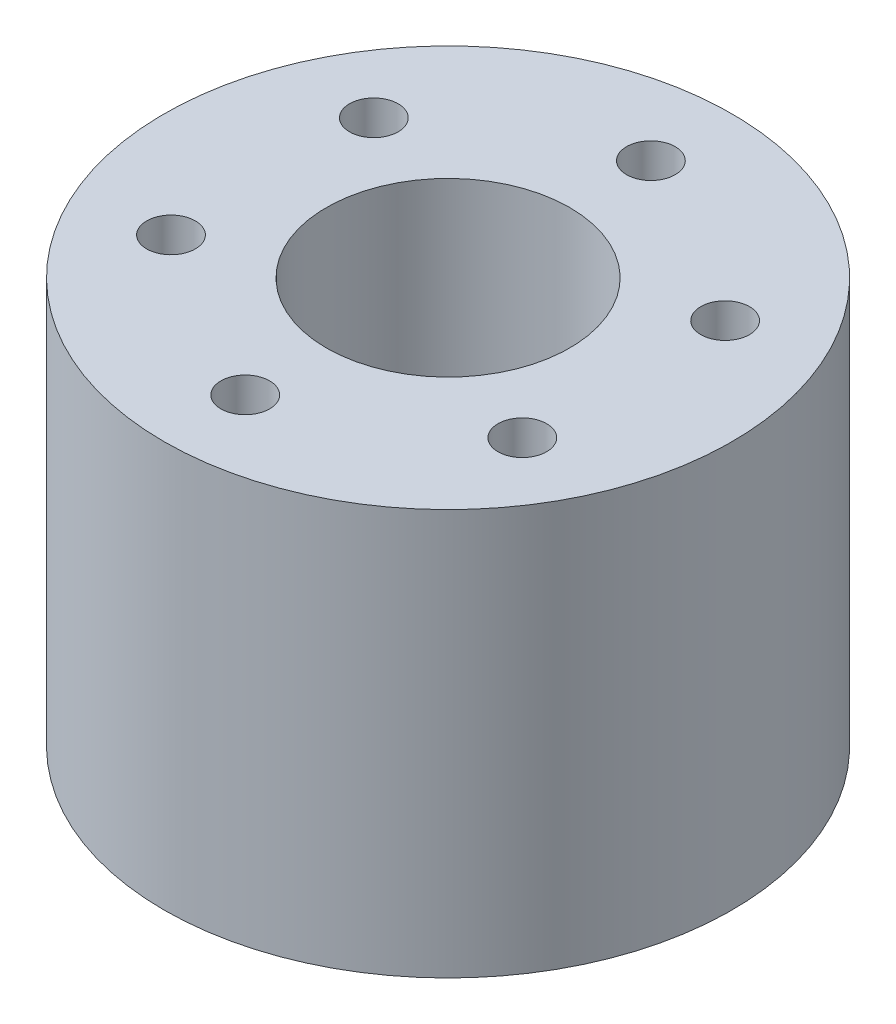
ISO-10303-21;
HEADER;
FILE_DESCRIPTION(('STEP AP214'),'2;1');
FILE_NAME('part.step','',(''),(''),'','','');
FILE_SCHEMA(('AUTOMOTIVE_DESIGN { 1 0 10303 214 1 1 1 1 }'));
ENDSEC;
DATA;
#1=APPLICATION_CONTEXT('core data for automotive mechanical design processes');
#2=APPLICATION_PROTOCOL_DEFINITION('international standard','automotive_design',2000,#1);
#3=PRODUCT_CONTEXT('',#1,'mechanical');
#4=PRODUCT('Part','Part','',(#3));
#5=PRODUCT_RELATED_PRODUCT_CATEGORY('part','',(#4));
#6=PRODUCT_DEFINITION_FORMATION('','',#4);
#7=PRODUCT_DEFINITION_CONTEXT('part definition',#1,'design');
#8=PRODUCT_DEFINITION('design','',#6,#7);
#9=PRODUCT_DEFINITION_SHAPE('','',#8);
#10=(LENGTH_UNIT() NAMED_UNIT(*) SI_UNIT(.MILLI.,.METRE.));
#11=(NAMED_UNIT(*) PLANE_ANGLE_UNIT() SI_UNIT($,.RADIAN.));
#12=(NAMED_UNIT(*) SI_UNIT($,.STERADIAN.) SOLID_ANGLE_UNIT());
#13=UNCERTAINTY_MEASURE_WITH_UNIT(LENGTH_MEASURE(1.E-05),#10,'distance_accuracy_value','');
#14=(GEOMETRIC_REPRESENTATION_CONTEXT(3) GLOBAL_UNCERTAINTY_ASSIGNED_CONTEXT((#13)) GLOBAL_UNIT_ASSIGNED_CONTEXT((#10,
#11,#12)) REPRESENTATION_CONTEXT('',''));
#15=CARTESIAN_POINT('',(0.,0.,0.));
#16=DIRECTION('',(0.,0.,1.));
#17=DIRECTION('',(1.,0.,0.));
#18=AXIS2_PLACEMENT_3D('',#15,#16,#17);
#19=CARTESIAN_POINT('',(0.,25.,0.));
#20=DIRECTION('',(0.,1.,0.));
#21=DIRECTION('',(0.,0.,1.));
#22=AXIS2_PLACEMENT_3D('',#19,#20,#21);
#23=PLANE('',#22);
#24=CARTESIAN_POINT('',(-10.8253175473055,25.,6.2499999999999));
#25=DIRECTION('',(0.,1.,0.));
#26=DIRECTION('',(0.,0.,1.));
#27=AXIS2_PLACEMENT_3D('',#24,#25,#26);
#28=CIRCLE('',#27,1.5);
#29=CARTESIAN_POINT('',(-10.8253175473055,25.,7.7499999999999));
#30=VERTEX_POINT('',#29);
#31=EDGE_CURVE('E94',#30,#30,#28,.T.);
#32=ORIENTED_EDGE('',*,*,#31,.F.);
#33=EDGE_LOOP('',(#32));
#34=FACE_BOUND('',#33,.T.);
#35=CARTESIAN_POINT('',(10.8253175473055,25.,6.25000000000005));
#36=DIRECTION('',(0.,1.,0.));
#37=DIRECTION('',(0.,0.,1.));
#38=AXIS2_PLACEMENT_3D('',#35,#36,#37);
#39=CIRCLE('',#38,1.5);
#40=CARTESIAN_POINT('',(10.8253175473055,25.,7.75000000000005));
#41=VERTEX_POINT('',#40);
#42=EDGE_CURVE('E78',#41,#41,#39,.T.);
#43=ORIENTED_EDGE('',*,*,#42,.F.);
#44=EDGE_LOOP('',(#43));
#45=FACE_BOUND('',#44,.T.);
#46=CARTESIAN_POINT('',(0.,25.,0.));
#47=DIRECTION('',(0.,1.,0.));
#48=DIRECTION('',(0.,0.,1.));
#49=AXIS2_PLACEMENT_3D('',#46,#47,#48);
#50=CIRCLE('',#49,7.5);
#51=CARTESIAN_POINT('',(0.,25.,7.5));
#52=VERTEX_POINT('',#51);
#53=EDGE_CURVE('E62',#52,#52,#50,.T.);
#54=ORIENTED_EDGE('',*,*,#53,.F.);
#55=EDGE_LOOP('',(#54));
#56=FACE_BOUND('',#55,.T.);
#57=CARTESIAN_POINT('',(0.,25.,0.));
#58=DIRECTION('',(0.,1.,0.));
#59=DIRECTION('',(0.,0.,1.));
#60=AXIS2_PLACEMENT_3D('',#57,#58,#59);
#61=CIRCLE('',#60,17.5);
#62=CARTESIAN_POINT('',(0.,25.,17.5));
#63=VERTEX_POINT('',#62);
#64=EDGE_CURVE('E10',#63,#63,#61,.T.);
#65=ORIENTED_EDGE('',*,*,#64,.T.);
#66=EDGE_LOOP('',(#65));
#67=FACE_BOUND('',#66,.T.);
#68=CARTESIAN_POINT('',(0.,25.,-12.5));
#69=DIRECTION('',(0.,1.,0.));
#70=DIRECTION('',(0.,0.,1.));
#71=AXIS2_PLACEMENT_3D('',#68,#69,#70);
#72=CIRCLE('',#71,1.5);
#73=CARTESIAN_POINT('',(0.,25.,-11.));
#74=VERTEX_POINT('',#73);
#75=EDGE_CURVE('E56',#74,#74,#72,.T.);
#76=ORIENTED_EDGE('',*,*,#75,.F.);
#77=EDGE_LOOP('',(#76));
#78=FACE_BOUND('',#77,.T.);
#79=CARTESIAN_POINT('',(10.8253175473055,25.,-6.24999999999998));
#80=DIRECTION('',(0.,1.,0.));
#81=DIRECTION('',(0.,0.,1.));
#82=AXIS2_PLACEMENT_3D('',#79,#80,#81);
#83=CIRCLE('',#82,1.5);
#84=CARTESIAN_POINT('',(10.8253175473055,25.,-4.74999999999998));
#85=VERTEX_POINT('',#84);
#86=EDGE_CURVE('E70',#85,#85,#83,.T.);
#87=ORIENTED_EDGE('',*,*,#86,.F.);
#88=EDGE_LOOP('',(#87));
#89=FACE_BOUND('',#88,.T.);
#90=CARTESIAN_POINT('',(0.,25.,12.5));
#91=DIRECTION('',(0.,1.,0.));
#92=DIRECTION('',(0.,0.,1.));
#93=AXIS2_PLACEMENT_3D('',#90,#91,#92);
#94=CIRCLE('',#93,1.5);
#95=CARTESIAN_POINT('',(0.,25.,14.));
#96=VERTEX_POINT('',#95);
#97=EDGE_CURVE('E86',#96,#96,#94,.T.);
#98=ORIENTED_EDGE('',*,*,#97,.F.);
#99=EDGE_LOOP('',(#98));
#100=FACE_BOUND('',#99,.T.);
#101=CARTESIAN_POINT('',(-10.8253175473054,25.,-6.25000000000013));
#102=DIRECTION('',(0.,1.,0.));
#103=DIRECTION('',(0.,0.,1.));
#104=AXIS2_PLACEMENT_3D('',#101,#102,#103);
#105=CIRCLE('',#104,1.5);
#106=CARTESIAN_POINT('',(-10.8253175473054,25.,-4.75000000000013));
#107=VERTEX_POINT('',#106);
#108=EDGE_CURVE('E102',#107,#107,#105,.T.);
#109=ORIENTED_EDGE('',*,*,#108,.F.);
#110=EDGE_LOOP('',(#109));
#111=FACE_BOUND('',#110,.T.);
#112=ADVANCED_FACE('F43',(#34,#45,#56,#67,#78,#89,#100,#111),#23,.T.);
#113=CARTESIAN_POINT('',(0.,0.,0.));
#114=DIRECTION('',(0.,1.,0.));
#115=DIRECTION('',(0.,0.,1.));
#116=AXIS2_PLACEMENT_3D('',#113,#114,#115);
#117=PLANE('',#116);
#118=CARTESIAN_POINT('',(0.,0.,0.));
#119=DIRECTION('',(0.,1.,0.));
#120=DIRECTION('',(0.,0.,1.));
#121=AXIS2_PLACEMENT_3D('',#118,#119,#120);
#122=CIRCLE('',#121,17.5);
#123=CARTESIAN_POINT('',(0.,0.,17.5));
#124=VERTEX_POINT('',#123);
#125=EDGE_CURVE('E47',#124,#124,#122,.T.);
#126=ORIENTED_EDGE('',*,*,#125,.F.);
#127=EDGE_LOOP('',(#126));
#128=FACE_BOUND('',#127,.T.);
#129=CARTESIAN_POINT('',(0.,0.,-12.5));
#130=DIRECTION('',(0.,1.,0.));
#131=DIRECTION('',(0.,0.,1.));
#132=AXIS2_PLACEMENT_3D('',#129,#130,#131);
#133=CIRCLE('',#132,1.5);
#134=CARTESIAN_POINT('',(0.,0.,-11.));
#135=VERTEX_POINT('',#134);
#136=EDGE_CURVE('E58',#135,#135,#133,.T.);
#137=ORIENTED_EDGE('',*,*,#136,.T.);
#138=EDGE_LOOP('',(#137));
#139=FACE_BOUND('',#138,.T.);
#140=CARTESIAN_POINT('',(0.,0.,0.));
#141=DIRECTION('',(0.,1.,0.));
#142=DIRECTION('',(0.,0.,1.));
#143=AXIS2_PLACEMENT_3D('',#140,#141,#142);
#144=CIRCLE('',#143,7.5);
#145=CARTESIAN_POINT('',(0.,0.,7.5));
#146=VERTEX_POINT('',#145);
#147=EDGE_CURVE('E66',#146,#146,#144,.T.);
#148=ORIENTED_EDGE('',*,*,#147,.T.);
#149=EDGE_LOOP('',(#148));
#150=FACE_BOUND('',#149,.T.);
#151=CARTESIAN_POINT('',(10.8253175473055,0.,-6.24999999999998));
#152=DIRECTION('',(0.,1.,0.));
#153=DIRECTION('',(0.,0.,1.));
#154=AXIS2_PLACEMENT_3D('',#151,#152,#153);
#155=CIRCLE('',#154,1.5);
#156=CARTESIAN_POINT('',(10.8253175473055,0.,-4.74999999999998));
#157=VERTEX_POINT('',#156);
#158=EDGE_CURVE('E74',#157,#157,#155,.T.);
#159=ORIENTED_EDGE('',*,*,#158,.T.);
#160=EDGE_LOOP('',(#159));
#161=FACE_BOUND('',#160,.T.);
#162=CARTESIAN_POINT('',(10.8253175473055,0.,6.25000000000005));
#163=DIRECTION('',(0.,1.,0.));
#164=DIRECTION('',(0.,0.,1.));
#165=AXIS2_PLACEMENT_3D('',#162,#163,#164);
#166=CIRCLE('',#165,1.5);
#167=CARTESIAN_POINT('',(10.8253175473055,0.,7.75000000000005));
#168=VERTEX_POINT('',#167);
#169=EDGE_CURVE('E82',#168,#168,#166,.T.);
#170=ORIENTED_EDGE('',*,*,#169,.T.);
#171=EDGE_LOOP('',(#170));
#172=FACE_BOUND('',#171,.T.);
#173=CARTESIAN_POINT('',(0.,0.,12.5));
#174=DIRECTION('',(0.,1.,0.));
#175=DIRECTION('',(0.,0.,1.));
#176=AXIS2_PLACEMENT_3D('',#173,#174,#175);
#177=CIRCLE('',#176,1.5);
#178=CARTESIAN_POINT('',(0.,0.,14.));
#179=VERTEX_POINT('',#178);
#180=EDGE_CURVE('E90',#179,#179,#177,.T.);
#181=ORIENTED_EDGE('',*,*,#180,.T.);
#182=EDGE_LOOP('',(#181));
#183=FACE_BOUND('',#182,.T.);
#184=CARTESIAN_POINT('',(-10.8253175473055,0.,6.2499999999999));
#185=DIRECTION('',(0.,1.,0.));
#186=DIRECTION('',(0.,0.,1.));
#187=AXIS2_PLACEMENT_3D('',#184,#185,#186);
#188=CIRCLE('',#187,1.5);
#189=CARTESIAN_POINT('',(-10.8253175473055,0.,7.7499999999999));
#190=VERTEX_POINT('',#189);
#191=EDGE_CURVE('E98',#190,#190,#188,.T.);
#192=ORIENTED_EDGE('',*,*,#191,.T.);
#193=EDGE_LOOP('',(#192));
#194=FACE_BOUND('',#193,.T.);
#195=CARTESIAN_POINT('',(-10.8253175473054,0.,-6.25000000000013));
#196=DIRECTION('',(0.,1.,0.));
#197=DIRECTION('',(0.,0.,1.));
#198=AXIS2_PLACEMENT_3D('',#195,#196,#197);
#199=CIRCLE('',#198,1.5);
#200=CARTESIAN_POINT('',(-10.8253175473054,0.,-4.75000000000013));
#201=VERTEX_POINT('',#200);
#202=EDGE_CURVE('E106',#201,#201,#199,.T.);
#203=ORIENTED_EDGE('',*,*,#202,.T.);
#204=EDGE_LOOP('',(#203));
#205=FACE_BOUND('',#204,.T.);
#206=ADVANCED_FACE('F118',(#128,#139,#150,#161,#172,#183,#194,#205),#117,.F.);
#207=CARTESIAN_POINT('',(0.,25.,0.));
#208=DIRECTION('',(0.,-1.,0.));
#209=DIRECTION('',(0.,0.,-1.));
#210=AXIS2_PLACEMENT_3D('',#207,#208,#209);
#211=CYLINDRICAL_SURFACE('',#210,17.5);
#212=ORIENTED_EDGE('',*,*,#64,.F.);
#213=EDGE_LOOP('',(#212));
#214=FACE_BOUND('',#213,.T.);
#215=ORIENTED_EDGE('',*,*,#125,.T.);
#216=EDGE_LOOP('',(#215));
#217=FACE_BOUND('',#216,.T.);
#218=ADVANCED_FACE('F45',(#214,#217),#211,.T.);
#219=CARTESIAN_POINT('',(0.,25.,-12.5));
#220=DIRECTION('',(0.,-1.,0.));
#221=DIRECTION('',(0.,0.,-1.));
#222=AXIS2_PLACEMENT_3D('',#219,#220,#221);
#223=CYLINDRICAL_SURFACE('',#222,1.5);
#224=ORIENTED_EDGE('',*,*,#75,.T.);
#225=EDGE_LOOP('',(#224));
#226=FACE_BOUND('',#225,.T.);
#227=ORIENTED_EDGE('',*,*,#136,.F.);
#228=EDGE_LOOP('',(#227));
#229=FACE_BOUND('',#228,.T.);
#230=ADVANCED_FACE('F128',(#226,#229),#223,.F.);
#231=CARTESIAN_POINT('',(0.,25.,0.));
#232=DIRECTION('',(0.,-1.,0.));
#233=DIRECTION('',(0.,0.,-1.));
#234=AXIS2_PLACEMENT_3D('',#231,#232,#233);
#235=CYLINDRICAL_SURFACE('',#234,7.5);
#236=ORIENTED_EDGE('',*,*,#53,.T.);
#237=EDGE_LOOP('',(#236));
#238=FACE_BOUND('',#237,.T.);
#239=ORIENTED_EDGE('',*,*,#147,.F.);
#240=EDGE_LOOP('',(#239));
#241=FACE_BOUND('',#240,.T.);
#242=ADVANCED_FACE('F131',(#238,#241),#235,.F.);
#243=CARTESIAN_POINT('',(10.8253175473055,25.,-6.24999999999998));
#244=DIRECTION('',(0.,-1.,0.));
#245=DIRECTION('',(0.,0.,-1.));
#246=AXIS2_PLACEMENT_3D('',#243,#244,#245);
#247=CYLINDRICAL_SURFACE('',#246,1.5);
#248=ORIENTED_EDGE('',*,*,#86,.T.);
#249=EDGE_LOOP('',(#248));
#250=FACE_BOUND('',#249,.T.);
#251=ORIENTED_EDGE('',*,*,#158,.F.);
#252=EDGE_LOOP('',(#251));
#253=FACE_BOUND('',#252,.T.);
#254=ADVANCED_FACE('F135',(#250,#253),#247,.F.);
#255=CARTESIAN_POINT('',(10.8253175473055,25.,6.25000000000005));
#256=DIRECTION('',(0.,-1.,0.));
#257=DIRECTION('',(0.,0.,-1.));
#258=AXIS2_PLACEMENT_3D('',#255,#256,#257);
#259=CYLINDRICAL_SURFACE('',#258,1.5);
#260=ORIENTED_EDGE('',*,*,#42,.T.);
#261=EDGE_LOOP('',(#260));
#262=FACE_BOUND('',#261,.T.);
#263=ORIENTED_EDGE('',*,*,#169,.F.);
#264=EDGE_LOOP('',(#263));
#265=FACE_BOUND('',#264,.T.);
#266=ADVANCED_FACE('F139',(#262,#265),#259,.F.);
#267=CARTESIAN_POINT('',(0.,25.,12.5));
#268=DIRECTION('',(0.,-1.,0.));
#269=DIRECTION('',(0.,0.,-1.));
#270=AXIS2_PLACEMENT_3D('',#267,#268,#269);
#271=CYLINDRICAL_SURFACE('',#270,1.5);
#272=ORIENTED_EDGE('',*,*,#97,.T.);
#273=EDGE_LOOP('',(#272));
#274=FACE_BOUND('',#273,.T.);
#275=ORIENTED_EDGE('',*,*,#180,.F.);
#276=EDGE_LOOP('',(#275));
#277=FACE_BOUND('',#276,.T.);
#278=ADVANCED_FACE('F143',(#274,#277),#271,.F.);
#279=CARTESIAN_POINT('',(-10.8253175473055,25.,6.2499999999999));
#280=DIRECTION('',(0.,-1.,0.));
#281=DIRECTION('',(0.,0.,-1.));
#282=AXIS2_PLACEMENT_3D('',#279,#280,#281);
#283=CYLINDRICAL_SURFACE('',#282,1.5);
#284=ORIENTED_EDGE('',*,*,#31,.T.);
#285=EDGE_LOOP('',(#284));
#286=FACE_BOUND('',#285,.T.);
#287=ORIENTED_EDGE('',*,*,#191,.F.);
#288=EDGE_LOOP('',(#287));
#289=FACE_BOUND('',#288,.T.);
#290=ADVANCED_FACE('F147',(#286,#289),#283,.F.);
#291=CARTESIAN_POINT('',(-10.8253175473054,25.,-6.25000000000013));
#292=DIRECTION('',(0.,-1.,0.));
#293=DIRECTION('',(0.,0.,-1.));
#294=AXIS2_PLACEMENT_3D('',#291,#292,#293);
#295=CYLINDRICAL_SURFACE('',#294,1.5);
#296=ORIENTED_EDGE('',*,*,#108,.T.);
#297=EDGE_LOOP('',(#296));
#298=FACE_BOUND('',#297,.T.);
#299=ORIENTED_EDGE('',*,*,#202,.F.);
#300=EDGE_LOOP('',(#299));
#301=FACE_BOUND('',#300,.T.);
#302=ADVANCED_FACE('F114',(#298,#301),#295,.F.);
#303=CLOSED_SHELL('',(#112,#206,#218,#230,#242,#254,#266,#278,#290,#302));
#304=MANIFOLD_SOLID_BREP('B2',#303);
#305=ADVANCED_BREP_SHAPE_REPRESENTATION('',(#18,#304),#14);
#306=SHAPE_DEFINITION_REPRESENTATION(#9,#305);
ENDSEC;
END-ISO-10303-21;
